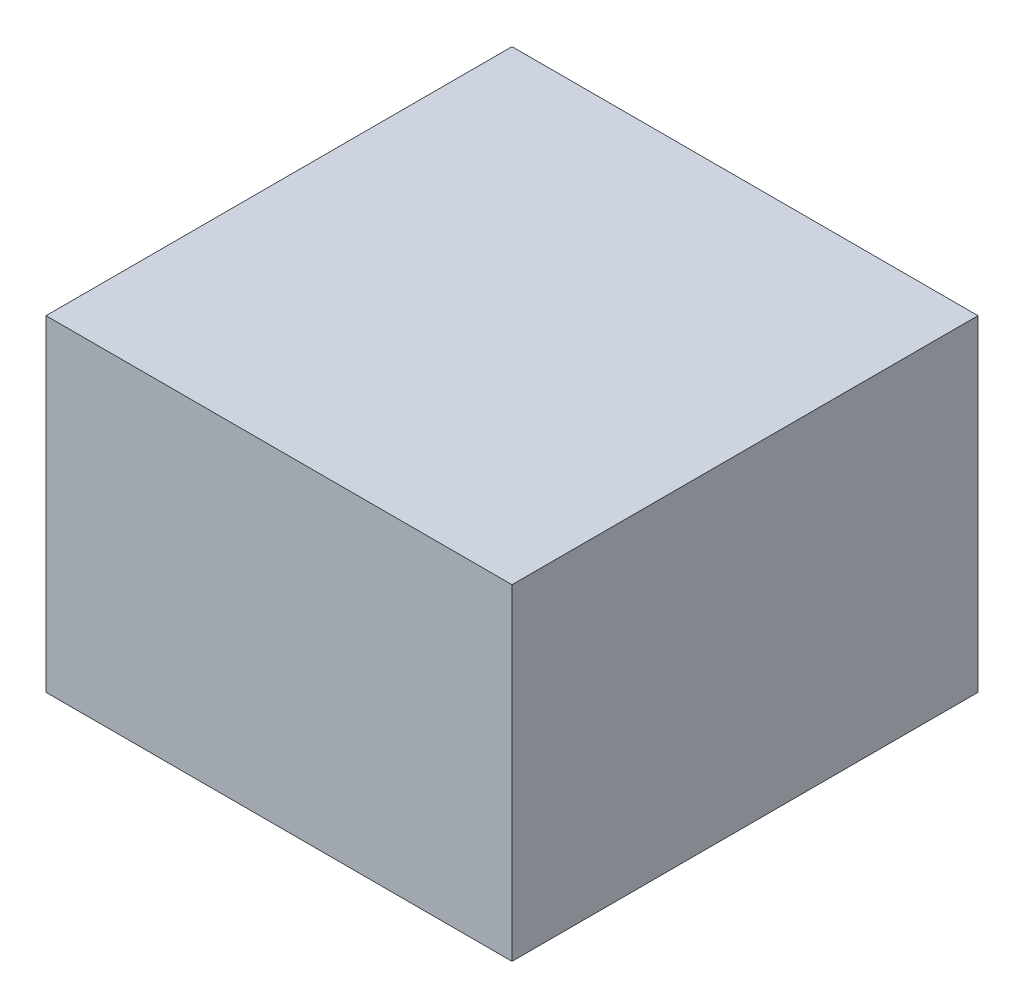
ISO-10303-21;
HEADER;
FILE_DESCRIPTION(('STEP AP214'),'2;1');
FILE_NAME('part.step','',(''),(''),'','','');
FILE_SCHEMA(('AUTOMOTIVE_DESIGN { 1 0 10303 214 1 1 1 1 }'));
ENDSEC;
DATA;
#1=APPLICATION_CONTEXT('core data for automotive mechanical design processes');
#2=APPLICATION_PROTOCOL_DEFINITION('international standard','automotive_design',2000,#1);
#3=PRODUCT_CONTEXT('',#1,'mechanical');
#4=PRODUCT('Part','Part','',(#3));
#5=PRODUCT_RELATED_PRODUCT_CATEGORY('part','',(#4));
#6=PRODUCT_DEFINITION_FORMATION('','',#4);
#7=PRODUCT_DEFINITION_CONTEXT('part definition',#1,'design');
#8=PRODUCT_DEFINITION('design','',#6,#7);
#9=PRODUCT_DEFINITION_SHAPE('','',#8);
#10=(LENGTH_UNIT() NAMED_UNIT(*) SI_UNIT(.MILLI.,.METRE.));
#11=(NAMED_UNIT(*) PLANE_ANGLE_UNIT() SI_UNIT($,.RADIAN.));
#12=(NAMED_UNIT(*) SI_UNIT($,.STERADIAN.) SOLID_ANGLE_UNIT());
#13=UNCERTAINTY_MEASURE_WITH_UNIT(LENGTH_MEASURE(1.E-05),#10,'distance_accuracy_value','');
#14=(GEOMETRIC_REPRESENTATION_CONTEXT(3) GLOBAL_UNCERTAINTY_ASSIGNED_CONTEXT((#13)) GLOBAL_UNIT_ASSIGNED_CONTEXT((#10,
#11,#12)) REPRESENTATION_CONTEXT('',''));
#15=CARTESIAN_POINT('',(0.,0.,0.));
#16=DIRECTION('',(0.,0.,1.));
#17=DIRECTION('',(1.,0.,0.));
#18=AXIS2_PLACEMENT_3D('',#15,#16,#17);
#19=CARTESIAN_POINT('',(0.,0.,100.));
#20=DIRECTION('',(0.,0.,1.));
#21=DIRECTION('',(1.,0.,0.));
#22=AXIS2_PLACEMENT_3D('',#19,#20,#21);
#23=PLANE('',#22);
#24=DIRECTION('',(-1.,0.,0.));
#25=VECTOR('',#24,1.);
#26=CARTESIAN_POINT('',(25.,20.,100.));
#27=LINE('',#26,#25);
#28=CARTESIAN_POINT('',(50.,20.,100.));
#29=VERTEX_POINT('',#28);
#30=CARTESIAN_POINT('',(-50.,20.,100.));
#31=VERTEX_POINT('',#30);
#32=EDGE_CURVE('E109',#29,#31,#27,.T.);
#33=ORIENTED_EDGE('',*,*,#32,.T.);
#34=DIRECTION('',(0.,-1.,0.));
#35=VECTOR('',#34,1.);
#36=CARTESIAN_POINT('',(-50.,-50.,100.));
#37=LINE('',#36,#35);
#38=CARTESIAN_POINT('',(-50.,-50.,100.));
#39=VERTEX_POINT('',#38);
#40=EDGE_CURVE('E11',#31,#39,#37,.T.);
#41=ORIENTED_EDGE('',*,*,#40,.T.);
#42=DIRECTION('',(1.,0.,0.));
#43=VECTOR('',#42,1.);
#44=CARTESIAN_POINT('',(50.,-50.,100.));
#45=LINE('',#44,#43);
#46=CARTESIAN_POINT('',(50.,-50.,100.));
#47=VERTEX_POINT('',#46);
#48=EDGE_CURVE('E74',#39,#47,#45,.T.);
#49=ORIENTED_EDGE('',*,*,#48,.T.);
#50=DIRECTION('',(0.,1.,0.));
#51=VECTOR('',#50,1.);
#52=CARTESIAN_POINT('',(50.,50.,100.));
#53=LINE('',#52,#51);
#54=EDGE_CURVE('E87',#47,#29,#53,.T.);
#55=ORIENTED_EDGE('',*,*,#54,.T.);
#56=EDGE_LOOP('',(#33,#41,#49,#55));
#57=FACE_BOUND('',#56,.T.);
#58=ADVANCED_FACE('F17',(#57),#23,.T.);
#59=CARTESIAN_POINT('',(-50.,50.,0.));
#60=DIRECTION('',(-1.,0.,0.));
#61=DIRECTION('',(0.,0.,1.));
#62=AXIS2_PLACEMENT_3D('',#59,#60,#61);
#63=PLANE('',#62);
#64=DIRECTION('',(0.,0.,-1.));
#65=VECTOR('',#64,1.);
#66=CARTESIAN_POINT('',(-50.,20.,0.));
#67=LINE('',#66,#65);
#68=CARTESIAN_POINT('',(-50.,20.,0.));
#69=VERTEX_POINT('',#68);
#70=EDGE_CURVE('E82',#31,#69,#67,.T.);
#71=ORIENTED_EDGE('',*,*,#70,.T.);
#72=DIRECTION('',(0.,1.,0.));
#73=VECTOR('',#72,1.);
#74=CARTESIAN_POINT('',(-50.,-50.,0.));
#75=LINE('',#74,#73);
#76=CARTESIAN_POINT('',(-50.,-50.,0.));
#77=VERTEX_POINT('',#76);
#78=EDGE_CURVE('E80',#77,#69,#75,.T.);
#79=ORIENTED_EDGE('',*,*,#78,.F.);
#80=DIRECTION('',(0.,0.,1.));
#81=VECTOR('',#80,1.);
#82=CARTESIAN_POINT('',(-50.,-50.,0.));
#83=LINE('',#82,#81);
#84=EDGE_CURVE('E27',#77,#39,#83,.T.);
#85=ORIENTED_EDGE('',*,*,#84,.T.);
#86=ORIENTED_EDGE('',*,*,#40,.F.);
#87=EDGE_LOOP('',(#71,#79,#85,#86));
#88=FACE_BOUND('',#87,.T.);
#89=ADVANCED_FACE('F19',(#88),#63,.T.);
#90=CARTESIAN_POINT('',(-50.,-50.,0.));
#91=DIRECTION('',(0.,-1.,0.));
#92=DIRECTION('',(0.,0.,-1.));
#93=AXIS2_PLACEMENT_3D('',#90,#91,#92);
#94=PLANE('',#93);
#95=DIRECTION('',(-1.,0.,0.));
#96=VECTOR('',#95,1.);
#97=CARTESIAN_POINT('',(50.,-50.,0.));
#98=LINE('',#97,#96);
#99=CARTESIAN_POINT('',(50.,-50.,0.));
#100=VERTEX_POINT('',#99);
#101=EDGE_CURVE('E72',#100,#77,#98,.T.);
#102=ORIENTED_EDGE('',*,*,#101,.F.);
#103=DIRECTION('',(0.,0.,1.));
#104=VECTOR('',#103,1.);
#105=CARTESIAN_POINT('',(50.,-50.,0.));
#106=LINE('',#105,#104);
#107=EDGE_CURVE('E62',#100,#47,#106,.T.);
#108=ORIENTED_EDGE('',*,*,#107,.T.);
#109=ORIENTED_EDGE('',*,*,#48,.F.);
#110=ORIENTED_EDGE('',*,*,#84,.F.);
#111=EDGE_LOOP('',(#102,#108,#109,#110));
#112=FACE_BOUND('',#111,.T.);
#113=ADVANCED_FACE('F70',(#112),#94,.T.);
#114=CARTESIAN_POINT('',(50.,-50.,0.));
#115=DIRECTION('',(1.,0.,0.));
#116=DIRECTION('',(0.,1.,0.));
#117=AXIS2_PLACEMENT_3D('',#114,#115,#116);
#118=PLANE('',#117);
#119=DIRECTION('',(0.,0.,1.));
#120=VECTOR('',#119,1.);
#121=CARTESIAN_POINT('',(50.,20.,0.));
#122=LINE('',#121,#120);
#123=CARTESIAN_POINT('',(50.,20.,0.));
#124=VERTEX_POINT('',#123);
#125=EDGE_CURVE('E95',#124,#29,#122,.T.);
#126=ORIENTED_EDGE('',*,*,#125,.T.);
#127=ORIENTED_EDGE('',*,*,#54,.F.);
#128=ORIENTED_EDGE('',*,*,#107,.F.);
#129=DIRECTION('',(0.,-1.,0.));
#130=VECTOR('',#129,1.);
#131=CARTESIAN_POINT('',(50.,50.,0.));
#132=LINE('',#131,#130);
#133=EDGE_CURVE('E90',#124,#100,#132,.T.);
#134=ORIENTED_EDGE('',*,*,#133,.F.);
#135=EDGE_LOOP('',(#126,#127,#128,#134));
#136=FACE_BOUND('',#135,.T.);
#137=ADVANCED_FACE('F104',(#136),#118,.T.);
#138=CARTESIAN_POINT('',(0.,0.,0.));
#139=DIRECTION('',(0.,0.,1.));
#140=DIRECTION('',(1.,0.,0.));
#141=AXIS2_PLACEMENT_3D('',#138,#139,#140);
#142=PLANE('',#141);
#143=DIRECTION('',(1.,0.,0.));
#144=VECTOR('',#143,1.);
#145=CARTESIAN_POINT('',(25.,20.,0.));
#146=LINE('',#145,#144);
#147=EDGE_CURVE('E116',#69,#124,#146,.T.);
#148=ORIENTED_EDGE('',*,*,#147,.T.);
#149=ORIENTED_EDGE('',*,*,#133,.T.);
#150=ORIENTED_EDGE('',*,*,#101,.T.);
#151=ORIENTED_EDGE('',*,*,#78,.T.);
#152=EDGE_LOOP('',(#148,#149,#150,#151));
#153=FACE_BOUND('',#152,.T.);
#154=ADVANCED_FACE('F89',(#153),#142,.F.);
#155=CARTESIAN_POINT('',(50.,20.,0.));
#156=DIRECTION('',(0.,-1.,0.));
#157=DIRECTION('',(0.,0.,-1.));
#158=AXIS2_PLACEMENT_3D('',#155,#156,#157);
#159=PLANE('',#158);
#160=ORIENTED_EDGE('',*,*,#147,.F.);
#161=ORIENTED_EDGE('',*,*,#70,.F.);
#162=ORIENTED_EDGE('',*,*,#32,.F.);
#163=ORIENTED_EDGE('',*,*,#125,.F.);
#164=EDGE_LOOP('',(#160,#161,#162,#163));
#165=FACE_BOUND('',#164,.T.);
#166=ADVANCED_FACE('F111',(#165),#159,.F.);
#167=CLOSED_SHELL('',(#58,#89,#113,#137,#154,#166));
#168=MANIFOLD_SOLID_BREP('B1',#167);
#169=ADVANCED_BREP_SHAPE_REPRESENTATION('',(#18,#168),#14);
#170=SHAPE_DEFINITION_REPRESENTATION(#9,#169);
ENDSEC;
END-ISO-10303-21;
